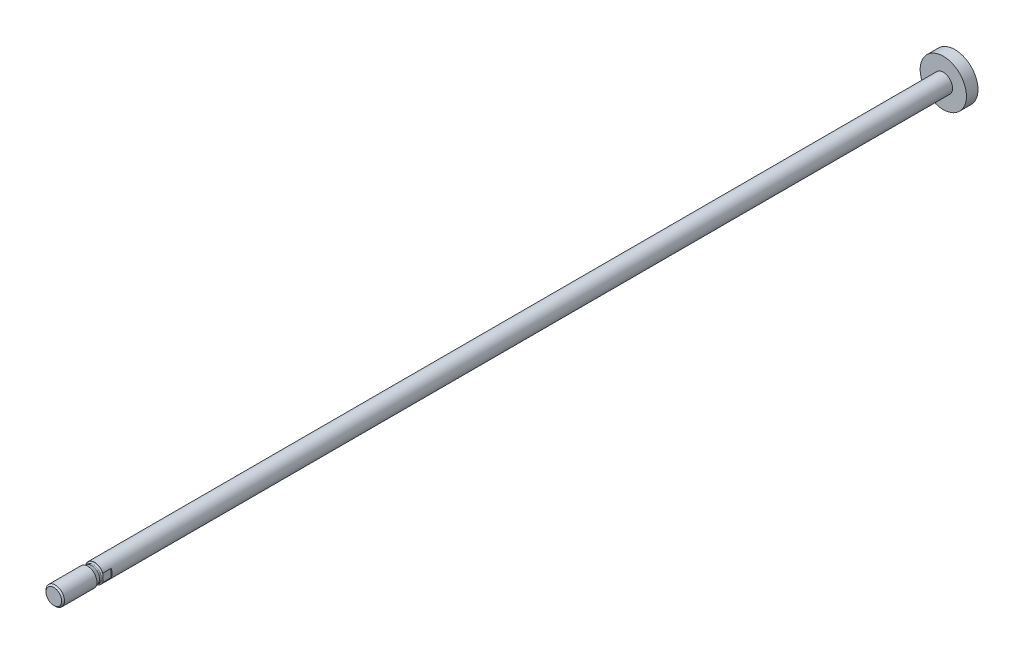
ISO-10303-21;
HEADER;
FILE_DESCRIPTION(('STEP AP214'),'2;1');
FILE_NAME('part.step','',(''),(''),'','','');
FILE_SCHEMA(('AUTOMOTIVE_DESIGN { 1 0 10303 214 1 1 1 1 }'));
ENDSEC;
DATA;
#1=APPLICATION_CONTEXT('core data for automotive mechanical design processes');
#2=APPLICATION_PROTOCOL_DEFINITION('international standard','automotive_design',2000,#1);
#3=PRODUCT_CONTEXT('',#1,'mechanical');
#4=PRODUCT('Part','Part','',(#3));
#5=PRODUCT_RELATED_PRODUCT_CATEGORY('part','',(#4));
#6=PRODUCT_DEFINITION_FORMATION('','',#4);
#7=PRODUCT_DEFINITION_CONTEXT('part definition',#1,'design');
#8=PRODUCT_DEFINITION('design','',#6,#7);
#9=PRODUCT_DEFINITION_SHAPE('','',#8);
#10=(LENGTH_UNIT() NAMED_UNIT(*) SI_UNIT(.MILLI.,.METRE.));
#11=(NAMED_UNIT(*) PLANE_ANGLE_UNIT() SI_UNIT($,.RADIAN.));
#12=(NAMED_UNIT(*) SI_UNIT($,.STERADIAN.) SOLID_ANGLE_UNIT());
#13=UNCERTAINTY_MEASURE_WITH_UNIT(LENGTH_MEASURE(1.E-05),#10,'distance_accuracy_value','');
#14=(GEOMETRIC_REPRESENTATION_CONTEXT(3) GLOBAL_UNCERTAINTY_ASSIGNED_CONTEXT((#13)) GLOBAL_UNIT_ASSIGNED_CONTEXT((#10,
#11,#12)) REPRESENTATION_CONTEXT('',''));
#15=CARTESIAN_POINT('',(0.,0.,0.));
#16=DIRECTION('',(0.,0.,1.));
#17=DIRECTION('',(1.,0.,0.));
#18=AXIS2_PLACEMENT_3D('',#15,#16,#17);
#19=CARTESIAN_POINT('',(0.,0.,28.));
#20=DIRECTION('',(0.,0.,-1.));
#21=DIRECTION('',(-1.,0.,0.));
#22=AXIS2_PLACEMENT_3D('',#19,#20,#21);
#23=PLANE('',#22);
#24=CARTESIAN_POINT('',(0.,0.,28.00000000002));
#25=DIRECTION('',(0.,0.,-1.));
#26=DIRECTION('',(-1.,0.,0.));
#27=AXIS2_PLACEMENT_3D('',#24,#25,#26);
#28=CIRCLE('',#27,4.23299999994242);
#29=CARTESIAN_POINT('',(-4.23299999994242,0.,28.00000000002));
#30=VERTEX_POINT('',#29);
#31=EDGE_CURVE('E19',#30,#30,#28,.T.);
#32=ORIENTED_EDGE('',*,*,#31,.F.);
#33=EDGE_LOOP('',(#32));
#34=FACE_BOUND('',#33,.T.);
#35=ADVANCED_FACE('F16',(#34),#23,.F.);
#36=CARTESIAN_POINT('',(0.,0.,27.2330000000807));
#37=DIRECTION('',(0.,0.,-1.));
#38=DIRECTION('',(-1.,0.,0.));
#39=AXIS2_PLACEMENT_3D('',#36,#37,#38);
#40=CONICAL_SURFACE('',#39,4.99999999988177,0.785398163397448);
#41=ORIENTED_EDGE('',*,*,#31,.T.);
#42=EDGE_LOOP('',(#41));
#43=FACE_BOUND('',#42,.T.);
#44=CARTESIAN_POINT('',(0.,0.,27.233));
#45=DIRECTION('',(0.,0.,1.));
#46=DIRECTION('',(1.,0.,0.));
#47=AXIS2_PLACEMENT_3D('',#44,#45,#46);
#48=CIRCLE('',#47,5.);
#49=CARTESIAN_POINT('',(5.,0.,27.233));
#50=VERTEX_POINT('',#49);
#51=EDGE_CURVE('E253',#50,#50,#48,.F.);
#52=ORIENTED_EDGE('',*,*,#51,.F.);
#53=EDGE_LOOP('',(#52));
#54=FACE_BOUND('',#53,.T.);
#55=ADVANCED_FACE('F240',(#43,#54),#40,.T.);
#56=CARTESIAN_POINT('',(0.,0.,5.));
#57=DIRECTION('',(0.,0.,1.));
#58=DIRECTION('',(1.,0.,0.));
#59=AXIS2_PLACEMENT_3D('',#56,#57,#58);
#60=CYLINDRICAL_SURFACE('',#59,5.);
#61=ORIENTED_EDGE('',*,*,#51,.T.);
#62=EDGE_LOOP('',(#61));
#63=FACE_BOUND('',#62,.T.);
#64=CARTESIAN_POINT('',(0.,0.,9.69798193557381));
#65=DIRECTION('',(0.,0.,1.));
#66=DIRECTION('',(1.,0.,0.));
#67=AXIS2_PLACEMENT_3D('',#64,#65,#66);
#68=CIRCLE('',#67,4.99999999999545);
#69=CARTESIAN_POINT('',(4.99999999999545,0.,9.69798193557381));
#70=VERTEX_POINT('',#69);
#71=EDGE_CURVE('E254',#70,#70,#68,.F.);
#72=ORIENTED_EDGE('',*,*,#71,.F.);
#73=EDGE_LOOP('',(#72));
#74=FACE_BOUND('',#73,.T.);
#75=ADVANCED_FACE('F237',(#63,#74),#60,.T.);
#76=CARTESIAN_POINT('',(0.,0.,9.69798193557381));
#77=DIRECTION('',(0.,0.,1.));
#78=DIRECTION('',(1.,0.,0.));
#79=AXIS2_PLACEMENT_3D('',#76,#77,#78);
#80=CONICAL_SURFACE('',#79,4.99999999999545,0.349065850396762);
#81=ORIENTED_EDGE('',*,*,#71,.T.);
#82=EDGE_LOOP('',(#81));
#83=FACE_BOUND('',#82,.T.);
#84=CARTESIAN_POINT('',(0.,0.,7.59941589757032));
#85=DIRECTION('',(0.,0.,-1.));
#86=DIRECTION('',(-1.,0.,0.));
#87=AXIS2_PLACEMENT_3D('',#84,#85,#86);
#88=CIRCLE('',#87,4.23618442752846);
#89=CARTESIAN_POINT('',(-4.23618442752846,0.,7.59941589757032));
#90=VERTEX_POINT('',#89);
#91=EDGE_CURVE('E220',#90,#90,#88,.F.);
#92=ORIENTED_EDGE('',*,*,#91,.T.);
#93=EDGE_LOOP('',(#92));
#94=FACE_BOUND('',#93,.T.);
#95=ADVANCED_FACE('F232',(#83,#94),#80,.T.);
#96=CARTESIAN_POINT('',(0.,0.,7.39420381157492));
#97=DIRECTION('',(0.,0.,-1.));
#98=DIRECTION('',(-1.,0.,0.));
#99=AXIS2_PLACEMENT_3D('',#96,#97,#98);
#100=TOROIDAL_SURFACE('',#99,4.8,0.599999999999999);
#101=ORIENTED_EDGE('',*,*,#91,.F.);
#102=EDGE_LOOP('',(#101));
#103=FACE_BOUND('',#102,.T.);
#104=CARTESIAN_POINT('',(0.,0.,7.39420381157492));
#105=DIRECTION('',(0.,0.,1.));
#106=DIRECTION('',(1.,0.,0.));
#107=AXIS2_PLACEMENT_3D('',#104,#105,#106);
#108=CIRCLE('',#107,4.2);
#109=CARTESIAN_POINT('',(4.2,0.,7.39420381157492));
#110=VERTEX_POINT('',#109);
#111=EDGE_CURVE('E211',#110,#110,#108,.F.);
#112=ORIENTED_EDGE('',*,*,#111,.F.);
#113=EDGE_LOOP('',(#112));
#114=FACE_BOUND('',#113,.T.);
#115=ADVANCED_FACE('F227',(#103,#114),#100,.F.);
#116=CARTESIAN_POINT('',(0.,12.5,-458.85));
#117=DIRECTION('',(0.,0.,1.));
#118=DIRECTION('',(1.,0.,0.));
#119=AXIS2_PLACEMENT_3D('',#116,#117,#118);
#120=PLANE('',#119);
#121=CARTESIAN_POINT('',(0.,0.,-458.85));
#122=DIRECTION('',(0.,0.,1.));
#123=DIRECTION('',(1.,0.,0.));
#124=AXIS2_PLACEMENT_3D('',#121,#122,#123);
#125=CIRCLE('',#124,12.5);
#126=CARTESIAN_POINT('',(12.5,0.,-458.85));
#127=VERTEX_POINT('',#126);
#128=EDGE_CURVE('E219',#127,#127,#125,.T.);
#129=ORIENTED_EDGE('',*,*,#128,.F.);
#130=EDGE_LOOP('',(#129));
#131=FACE_BOUND('',#130,.T.);
#132=ADVANCED_FACE('F231',(#131),#120,.F.);
#133=CARTESIAN_POINT('',(0.,0.,5.));
#134=DIRECTION('',(0.,0.,1.));
#135=DIRECTION('',(1.,0.,0.));
#136=AXIS2_PLACEMENT_3D('',#133,#134,#135);
#137=CYLINDRICAL_SURFACE('',#136,4.2);
#138=ORIENTED_EDGE('',*,*,#111,.T.);
#139=EDGE_LOOP('',(#138));
#140=FACE_BOUND('',#139,.T.);
#141=CARTESIAN_POINT('',(0.,0.,6.6));
#142=DIRECTION('',(0.,0.,-1.));
#143=DIRECTION('',(-1.,0.,0.));
#144=AXIS2_PLACEMENT_3D('',#141,#142,#143);
#145=CIRCLE('',#144,4.2);
#146=CARTESIAN_POINT('',(-4.2,0.,6.6));
#147=VERTEX_POINT('',#146);
#148=EDGE_CURVE('E275',#147,#147,#145,.F.);
#149=ORIENTED_EDGE('',*,*,#148,.T.);
#150=EDGE_LOOP('',(#149));
#151=FACE_BOUND('',#150,.T.);
#152=ADVANCED_FACE('F270',(#140,#151),#137,.T.);
#153=CARTESIAN_POINT('',(0.,0.,-458.85));
#154=DIRECTION('',(0.,0.,1.));
#155=DIRECTION('',(1.,0.,0.));
#156=AXIS2_PLACEMENT_3D('',#153,#154,#155);
#157=CYLINDRICAL_SURFACE('',#156,12.5);
#158=CARTESIAN_POINT('',(0.,0.,-452.6));
#159=DIRECTION('',(0.,0.,1.));
#160=DIRECTION('',(1.,0.,0.));
#161=AXIS2_PLACEMENT_3D('',#158,#159,#160);
#162=CIRCLE('',#161,12.5);
#163=CARTESIAN_POINT('',(12.5,0.,-452.6));
#164=VERTEX_POINT('',#163);
#165=EDGE_CURVE('E203',#164,#164,#162,.F.);
#166=ORIENTED_EDGE('',*,*,#165,.T.);
#167=EDGE_LOOP('',(#166));
#168=FACE_BOUND('',#167,.T.);
#169=ORIENTED_EDGE('',*,*,#128,.T.);
#170=EDGE_LOOP('',(#169));
#171=FACE_BOUND('',#170,.T.);
#172=ADVANCED_FACE('F173',(#168,#171),#157,.T.);
#173=CARTESIAN_POINT('',(0.,0.,6.6));
#174=DIRECTION('',(0.,0.,-1.));
#175=DIRECTION('',(-1.,0.,0.));
#176=AXIS2_PLACEMENT_3D('',#173,#174,#175);
#177=TOROIDAL_SURFACE('',#176,4.8,0.599999999999998);
#178=ORIENTED_EDGE('',*,*,#148,.F.);
#179=EDGE_LOOP('',(#178));
#180=FACE_BOUND('',#179,.T.);
#181=CARTESIAN_POINT('',(-4.5,-1.670329308849,6.));
#182=CARTESIAN_POINT('',(-4.5,-1.6369330513631,6.00000117040223));
#183=CARTESIAN_POINT('',(-4.5,-1.60353870008505,6.00033761281317));
#184=CARTESIAN_POINT('',(-4.5,-1.53678402517574,6.00158286188886));
#185=CARTESIAN_POINT('',(-4.5,-1.50342369418502,6.00249126346591));
#186=CARTESIAN_POINT('',(-4.5,-1.43672915385537,6.00478221519337));
#187=CARTESIAN_POINT('',(-4.5,-1.403394939861,6.00616463519658));
#188=CARTESIAN_POINT('',(-4.5,-1.33675010316127,6.0093127773252));
#189=CARTESIAN_POINT('',(-4.5,-1.30343947758629,6.0110784396036));
#190=CARTESIAN_POINT('',(-4.5,-1.23682740984282,6.01490639659544));
#191=CARTESIAN_POINT('',(-4.5,-1.20352597189788,6.01696876357747));
#192=CARTESIAN_POINT('',(-4.5,-1.13692453490198,6.02130706454382));
#193=CARTESIAN_POINT('',(-4.5,-1.10362454110037,6.02358307854023));
#194=CARTESIAN_POINT('',(-4.5,-0.970055500660211,6.03297450091988));
#195=CARTESIAN_POINT('',(-4.5,-0.869824880093467,6.04061462109113));
#196=CARTESIAN_POINT('',(-4.5,-0.669294095444825,6.05497755898394));
#197=CARTESIAN_POINT('',(-4.5,-0.568993932116027,6.06170038648787));
#198=CARTESIAN_POINT('',(-4.5,-0.368332410875038,6.07244573968657));
#199=CARTESIAN_POINT('',(-4.5,-0.26797120652601,6.076470876583));
#200=CARTESIAN_POINT('',(-4.5,-0.0672525736976672,6.08072036023677));
#201=CARTESIAN_POINT('',(-4.5,0.0331047738284561,6.08094818941855));
#202=CARTESIAN_POINT('',(-4.5,0.233769564385185,6.07754740137777));
#203=CARTESIAN_POINT('',(-4.5,0.334076991677368,6.07391793974281));
#204=CARTESIAN_POINT('',(-4.5,0.534637397699597,6.06379928349027));
#205=CARTESIAN_POINT('',(-4.5,0.634890214053077,6.05730714852695));
#206=CARTESIAN_POINT('',(-4.5,0.835373518086889,6.04317942656312));
#207=CARTESIAN_POINT('',(-4.5,0.935603947060965,6.03554308551951));
#208=CARTESIAN_POINT('',(-4.5,1.13611388640718,6.02119700715942));
#209=CARTESIAN_POINT('',(-4.5,1.23639337665127,6.01448702408238));
#210=CARTESIAN_POINT('',(-4.5,1.39231556393481,6.00654495544654));
#211=CARTESIAN_POINT('',(-4.5,1.44789697514886,6.00420470218304));
#212=CARTESIAN_POINT('',(-4.5,1.55909116687587,6.00093588356944));
#213=CARTESIAN_POINT('',(-4.5,1.61470394147135,6.00000710765029));
#214=CARTESIAN_POINT('',(-4.5,1.67032930884898,6.));
#215=B_SPLINE_CURVE_WITH_KNOTS('',3,(#181,#182,#183,#184,#185,#186,#187,#188,#189,#190,#191,
#192,#193,#194,#195,#196,#197,#198,#199,#200,#201,#202,#203,#204,#205,#206,#207,#208,#209,#210,
#211,#212,#213,#214),.UNSPECIFIED.,.F.,.F.,(4,2,2,2,2,2,2,2,2,2,2,2,2,2,2,2,4),(0.,
0.100184360814044,0.200297846163573,0.300383866187946,0.400454268039522,0.500549085512339,
0.600681539794873,0.902246113316891,1.20380747058151,1.50507651146084,1.80606925014599,
2.10712789373254,2.4084964874746,2.71006456677907,3.01155248641771,3.17842827063363,
3.34527915730057),.UNSPECIFIED.);
#216=CARTESIAN_POINT('',(-4.5,-1.670329308849,6.));
#217=VERTEX_POINT('',#216);
#218=CARTESIAN_POINT('',(-4.5,1.67032930884898,5.99999999999986));
#219=VERTEX_POINT('',#218);
#220=EDGE_CURVE('E99',#217,#219,#215,.T.);
#221=ORIENTED_EDGE('',*,*,#220,.F.);
#222=CARTESIAN_POINT('',(0.,0.,6.));
#223=DIRECTION('',(0.,0.,1.));
#224=DIRECTION('',(-0.9375,-0.347985272676876,0.));
#225=AXIS2_PLACEMENT_3D('',#222,#223,#224);
#226=CIRCLE('',#225,4.79999999999999);
#227=CARTESIAN_POINT('',(4.5,-1.67032930884898,5.99999999999993));
#228=VERTEX_POINT('',#227);
#229=EDGE_CURVE('E143',#217,#228,#226,.T.);
#230=ORIENTED_EDGE('',*,*,#229,.T.);
#231=CARTESIAN_POINT('',(4.5,1.670329308849,6.));
#232=CARTESIAN_POINT('',(4.5,1.6369330513631,6.00000117040223));
#233=CARTESIAN_POINT('',(4.5,1.60353870008505,6.00033761281317));
#234=CARTESIAN_POINT('',(4.5,1.53678402517574,6.00158286188886));
#235=CARTESIAN_POINT('',(4.5,1.50342369418502,6.00249126346591));
#236=CARTESIAN_POINT('',(4.5,1.43672915385538,6.00478221519337));
#237=CARTESIAN_POINT('',(4.5,1.403394939861,6.00616463519658));
#238=CARTESIAN_POINT('',(4.5,1.33675010316128,6.0093127773252));
#239=CARTESIAN_POINT('',(4.5,1.30343947758629,6.0110784396036));
#240=CARTESIAN_POINT('',(4.5,1.23682740984282,6.01490639659544));
#241=CARTESIAN_POINT('',(4.5,1.20352597189788,6.01696876357747));
#242=CARTESIAN_POINT('',(4.5,1.13692453490198,6.02130706454382));
#243=CARTESIAN_POINT('',(4.5,1.10362454110037,6.02358307854023));
#244=CARTESIAN_POINT('',(4.5,0.970055500660213,6.03297450091988));
#245=CARTESIAN_POINT('',(4.5,0.869824880093468,6.04061462109113));
#246=CARTESIAN_POINT('',(4.5,0.669294095444826,6.05497755898394));
#247=CARTESIAN_POINT('',(4.5,0.568993932116028,6.06170038648787));
#248=CARTESIAN_POINT('',(4.5,0.368332410875039,6.07244573968657));
#249=CARTESIAN_POINT('',(4.5,0.267971206526011,6.076470876583));
#250=CARTESIAN_POINT('',(4.5,0.0672525736976679,6.08072036023677));
#251=CARTESIAN_POINT('',(4.5,-0.0331047738284553,6.08094818941855));
#252=CARTESIAN_POINT('',(4.5,-0.233769564385184,6.07754740137777));
#253=CARTESIAN_POINT('',(4.5,-0.334076991677367,6.07391793974281));
#254=CARTESIAN_POINT('',(4.5,-0.534637397699596,6.06379928349027));
#255=CARTESIAN_POINT('',(4.5,-0.634890214053076,6.05730714852695));
#256=CARTESIAN_POINT('',(4.5,-0.835373518086889,6.04317942656312));
#257=CARTESIAN_POINT('',(4.5,-0.935603947060965,6.03554308551951));
#258=CARTESIAN_POINT('',(4.5,-1.13611388640718,6.02119700715942));
#259=CARTESIAN_POINT('',(4.5,-1.23639337665127,6.01448702408238));
#260=CARTESIAN_POINT('',(4.5,-1.39231556393481,6.00654495544654));
#261=CARTESIAN_POINT('',(4.5,-1.44789697514886,6.00420470218304));
#262=CARTESIAN_POINT('',(4.5,-1.55909116687587,6.00093588356944));
#263=CARTESIAN_POINT('',(4.5,-1.61470394147135,6.00000710765029));
#264=CARTESIAN_POINT('',(4.5,-1.67032930884898,6.));
#265=B_SPLINE_CURVE_WITH_KNOTS('',3,(#231,#232,#233,#234,#235,#236,#237,#238,#239,#240,#241,
#242,#243,#244,#245,#246,#247,#248,#249,#250,#251,#252,#253,#254,#255,#256,#257,#258,#259,#260,
#261,#262,#263,#264),.UNSPECIFIED.,.F.,.F.,(4,2,2,2,2,2,2,2,2,2,2,2,2,2,2,2,4),(0.,
0.100184360814044,0.200297846163573,0.300383866187946,0.400454268039522,0.500549085512339,
0.600681539794873,0.902246113316891,1.20380747058151,1.50507651146084,1.80606925014599,
2.10712789373254,2.4084964874746,2.71006456677907,3.01155248641771,3.17842827063363,
3.34527915730057),.UNSPECIFIED.);
#266=CARTESIAN_POINT('',(4.5,1.670329308849,6.));
#267=VERTEX_POINT('',#266);
#268=EDGE_CURVE('E75',#267,#228,#265,.T.);
#269=ORIENTED_EDGE('',*,*,#268,.F.);
#270=CARTESIAN_POINT('',(0.,0.,6.));
#271=DIRECTION('',(0.,0.,1.));
#272=DIRECTION('',(0.9375,0.347985272676875,0.));
#273=AXIS2_PLACEMENT_3D('',#270,#271,#272);
#274=CIRCLE('',#273,4.79999999999999);
#275=EDGE_CURVE('E70',#267,#219,#274,.T.);
#276=ORIENTED_EDGE('',*,*,#275,.T.);
#277=EDGE_LOOP('',(#221,#230,#269,#276));
#278=FACE_BOUND('',#277,.T.);
#279=ADVANCED_FACE('F110',(#180,#278),#177,.F.);
#280=CARTESIAN_POINT('',(0.,5.,-452.6));
#281=DIRECTION('',(0.,0.,-1.));
#282=DIRECTION('',(-1.,0.,0.));
#283=AXIS2_PLACEMENT_3D('',#280,#281,#282);
#284=PLANE('',#283);
#285=CARTESIAN_POINT('',(0.,0.,-452.6));
#286=DIRECTION('',(0.,0.,1.));
#287=DIRECTION('',(1.,0.,0.));
#288=AXIS2_PLACEMENT_3D('',#285,#286,#287);
#289=CIRCLE('',#288,5.);
#290=CARTESIAN_POINT('',(5.,0.,-452.6));
#291=VERTEX_POINT('',#290);
#292=EDGE_CURVE('E92',#291,#291,#289,.T.);
#293=ORIENTED_EDGE('',*,*,#292,.F.);
#294=EDGE_LOOP('',(#293));
#295=FACE_BOUND('',#294,.T.);
#296=ORIENTED_EDGE('',*,*,#165,.F.);
#297=EDGE_LOOP('',(#296));
#298=FACE_BOUND('',#297,.T.);
#299=ADVANCED_FACE('F166',(#295,#298),#284,.F.);
#300=CARTESIAN_POINT('',(0.,0.,6.));
#301=DIRECTION('',(0.,0.,-1.));
#302=DIRECTION('',(-1.,0.,0.));
#303=AXIS2_PLACEMENT_3D('',#300,#301,#302);
#304=PLANE('',#303);
#305=CARTESIAN_POINT('',(0.,0.,6.00000000000001));
#306=DIRECTION('',(0.,0.,1.));
#307=DIRECTION('',(1.,0.,0.));
#308=AXIS2_PLACEMENT_3D('',#305,#306,#307);
#309=CIRCLE('',#308,5.);
#310=CARTESIAN_POINT('',(-4.5,2.17944947177034,5.99999999999982));
#311=VERTEX_POINT('',#310);
#312=CARTESIAN_POINT('',(4.5,2.17944947177034,6.00000000000001));
#313=VERTEX_POINT('',#312);
#314=EDGE_CURVE('E67',#311,#313,#309,.F.);
#315=ORIENTED_EDGE('',*,*,#314,.F.);
#316=DIRECTION('',(0.,1.,0.));
#317=VECTOR('',#316,1.);
#318=CARTESIAN_POINT('',(-4.5,-9.,5.99999999999964));
#319=LINE('',#318,#317);
#320=EDGE_CURVE('E57',#219,#311,#319,.T.);
#321=ORIENTED_EDGE('',*,*,#320,.F.);
#322=ORIENTED_EDGE('',*,*,#275,.F.);
#323=DIRECTION('',(0.,1.,0.));
#324=VECTOR('',#323,1.);
#325=CARTESIAN_POINT('',(4.5,9.,6.00000000000001));
#326=LINE('',#325,#324);
#327=EDGE_CURVE('E63',#313,#267,#326,.F.);
#328=ORIENTED_EDGE('',*,*,#327,.F.);
#329=EDGE_LOOP('',(#315,#321,#322,#328));
#330=FACE_BOUND('',#329,.T.);
#331=ADVANCED_FACE('F65',(#330),#304,.F.);
#332=CARTESIAN_POINT('',(0.,0.,1.5));
#333=DIRECTION('',(0.,0.,1.));
#334=DIRECTION('',(1.,0.,0.));
#335=AXIS2_PLACEMENT_3D('',#332,#333,#334);
#336=PLANE('',#335);
#337=CARTESIAN_POINT('',(0.,0.,1.5));
#338=DIRECTION('',(0.,0.,1.));
#339=DIRECTION('',(1.,0.,0.));
#340=AXIS2_PLACEMENT_3D('',#337,#338,#339);
#341=CIRCLE('',#340,5.);
#342=CARTESIAN_POINT('',(4.5,2.17944947177034,1.5));
#343=VERTEX_POINT('',#342);
#344=CARTESIAN_POINT('',(4.5,-2.17944947177034,1.5));
#345=VERTEX_POINT('',#344);
#346=EDGE_CURVE('E85',#343,#345,#341,.F.);
#347=ORIENTED_EDGE('',*,*,#346,.F.);
#348=DIRECTION('',(0.,1.,0.));
#349=VECTOR('',#348,1.);
#350=CARTESIAN_POINT('',(4.5,9.,1.5));
#351=LINE('',#350,#349);
#352=EDGE_CURVE('E76',#345,#343,#351,.T.);
#353=ORIENTED_EDGE('',*,*,#352,.F.);
#354=EDGE_LOOP('',(#347,#353));
#355=FACE_BOUND('',#354,.T.);
#356=ADVANCED_FACE('F165',(#355),#336,.T.);
#357=CARTESIAN_POINT('',(4.5,9.,7.));
#358=DIRECTION('',(1.,0.,0.));
#359=DIRECTION('',(0.,0.,-1.));
#360=AXIS2_PLACEMENT_3D('',#357,#358,#359);
#361=PLANE('',#360);
#362=ORIENTED_EDGE('',*,*,#268,.T.);
#363=DIRECTION('',(0.,1.,0.));
#364=VECTOR('',#363,1.);
#365=CARTESIAN_POINT('',(4.5,0.,6.));
#366=LINE('',#365,#364);
#367=CARTESIAN_POINT('',(4.5,-2.17944947177034,6.));
#368=VERTEX_POINT('',#367);
#369=EDGE_CURVE('E136',#228,#368,#366,.F.);
#370=ORIENTED_EDGE('',*,*,#369,.T.);
#371=DIRECTION('',(0.,0.,1.));
#372=VECTOR('',#371,1.);
#373=CARTESIAN_POINT('',(4.5,-2.17944947177034,-458.85));
#374=LINE('',#373,#372);
#375=EDGE_CURVE('E146',#345,#368,#374,.T.);
#376=ORIENTED_EDGE('',*,*,#375,.F.);
#377=ORIENTED_EDGE('',*,*,#352,.T.);
#378=DIRECTION('',(0.,0.,1.));
#379=VECTOR('',#378,1.);
#380=CARTESIAN_POINT('',(4.5,2.17944947177034,-458.85));
#381=LINE('',#380,#379);
#382=EDGE_CURVE('E79',#313,#343,#381,.F.);
#383=ORIENTED_EDGE('',*,*,#382,.F.);
#384=ORIENTED_EDGE('',*,*,#327,.T.);
#385=EDGE_LOOP('',(#362,#370,#376,#377,#383,#384));
#386=FACE_BOUND('',#385,.T.);
#387=ADVANCED_FACE('F80',(#386),#361,.T.);
#388=CARTESIAN_POINT('',(0.,0.,6.));
#389=DIRECTION('',(0.,0.,-1.));
#390=DIRECTION('',(-1.,0.,0.));
#391=AXIS2_PLACEMENT_3D('',#388,#389,#390);
#392=PLANE('',#391);
#393=CARTESIAN_POINT('',(0.,0.,6.00000000000001));
#394=DIRECTION('',(0.,0.,1.));
#395=DIRECTION('',(1.,0.,0.));
#396=AXIS2_PLACEMENT_3D('',#393,#394,#395);
#397=CIRCLE('',#396,5.);
#398=CARTESIAN_POINT('',(-4.5,-2.17944947177034,6.00000000000001));
#399=VERTEX_POINT('',#398);
#400=EDGE_CURVE('E148',#368,#399,#397,.F.);
#401=ORIENTED_EDGE('',*,*,#400,.F.);
#402=ORIENTED_EDGE('',*,*,#369,.F.);
#403=ORIENTED_EDGE('',*,*,#229,.F.);
#404=DIRECTION('',(0.,1.,0.));
#405=VECTOR('',#404,1.);
#406=CARTESIAN_POINT('',(-4.5,-9.,6.00000000000001));
#407=LINE('',#406,#405);
#408=EDGE_CURVE('E101',#399,#217,#407,.T.);
#409=ORIENTED_EDGE('',*,*,#408,.F.);
#410=EDGE_LOOP('',(#401,#402,#403,#409));
#411=FACE_BOUND('',#410,.T.);
#412=ADVANCED_FACE('F121',(#411),#392,.F.);
#413=CARTESIAN_POINT('',(-4.5,-9.,7.));
#414=DIRECTION('',(-1.,0.,0.));
#415=DIRECTION('',(0.,0.,1.));
#416=AXIS2_PLACEMENT_3D('',#413,#414,#415);
#417=PLANE('',#416);
#418=ORIENTED_EDGE('',*,*,#220,.T.);
#419=ORIENTED_EDGE('',*,*,#320,.T.);
#420=DIRECTION('',(0.,0.,1.));
#421=VECTOR('',#420,1.);
#422=CARTESIAN_POINT('',(-4.5,2.17944947177034,-458.85));
#423=LINE('',#422,#421);
#424=CARTESIAN_POINT('',(-4.5,2.17944947177034,1.5));
#425=VERTEX_POINT('',#424);
#426=EDGE_CURVE('E90',#425,#311,#423,.T.);
#427=ORIENTED_EDGE('',*,*,#426,.F.);
#428=DIRECTION('',(0.,1.,0.));
#429=VECTOR('',#428,1.);
#430=CARTESIAN_POINT('',(-4.5,0.,1.5));
#431=LINE('',#430,#429);
#432=CARTESIAN_POINT('',(-4.5,-2.17944947177034,1.5));
#433=VERTEX_POINT('',#432);
#434=EDGE_CURVE('E34',#433,#425,#431,.T.);
#435=ORIENTED_EDGE('',*,*,#434,.F.);
#436=DIRECTION('',(0.,0.,1.));
#437=VECTOR('',#436,1.);
#438=CARTESIAN_POINT('',(-4.5,-2.17944947177034,-458.85));
#439=LINE('',#438,#437);
#440=EDGE_CURVE('E25',#399,#433,#439,.F.);
#441=ORIENTED_EDGE('',*,*,#440,.F.);
#442=ORIENTED_EDGE('',*,*,#408,.T.);
#443=EDGE_LOOP('',(#418,#419,#427,#435,#441,#442));
#444=FACE_BOUND('',#443,.T.);
#445=ADVANCED_FACE('F115',(#444),#417,.T.);
#446=CARTESIAN_POINT('',(0.,0.,1.5));
#447=DIRECTION('',(0.,0.,1.));
#448=DIRECTION('',(1.,0.,0.));
#449=AXIS2_PLACEMENT_3D('',#446,#447,#448);
#450=PLANE('',#449);
#451=CARTESIAN_POINT('',(0.,0.,1.5));
#452=DIRECTION('',(0.,0.,1.));
#453=DIRECTION('',(1.,0.,0.));
#454=AXIS2_PLACEMENT_3D('',#451,#452,#453);
#455=CIRCLE('',#454,5.);
#456=EDGE_CURVE('E11',#433,#425,#455,.F.);
#457=ORIENTED_EDGE('',*,*,#456,.F.);
#458=ORIENTED_EDGE('',*,*,#434,.T.);
#459=EDGE_LOOP('',(#457,#458));
#460=FACE_BOUND('',#459,.T.);
#461=ADVANCED_FACE('F120',(#460),#450,.T.);
#462=CARTESIAN_POINT('',(0.,0.,-458.85));
#463=DIRECTION('',(0.,0.,1.));
#464=DIRECTION('',(1.,0.,0.));
#465=AXIS2_PLACEMENT_3D('',#462,#463,#464);
#466=CYLINDRICAL_SURFACE('',#465,5.);
#467=ORIENTED_EDGE('',*,*,#440,.T.);
#468=ORIENTED_EDGE('',*,*,#456,.T.);
#469=ORIENTED_EDGE('',*,*,#426,.T.);
#470=ORIENTED_EDGE('',*,*,#314,.T.);
#471=ORIENTED_EDGE('',*,*,#382,.T.);
#472=ORIENTED_EDGE('',*,*,#346,.T.);
#473=ORIENTED_EDGE('',*,*,#375,.T.);
#474=ORIENTED_EDGE('',*,*,#400,.T.);
#475=EDGE_LOOP('',(#467,#468,#469,#470,#471,#472,#473,#474));
#476=FACE_BOUND('',#475,.T.);
#477=ORIENTED_EDGE('',*,*,#292,.T.);
#478=EDGE_LOOP('',(#477));
#479=FACE_BOUND('',#478,.T.);
#480=ADVANCED_FACE('F88',(#476,#479),#466,.T.);
#481=CLOSED_SHELL('',(#35,#55,#75,#95,#115,#132,#152,#172,#279,#299,#331,#356,#387,#412,#445,
#461,#480));
#482=MANIFOLD_SOLID_BREP('B1',#481);
#483=ADVANCED_BREP_SHAPE_REPRESENTATION('',(#18,#482),#14);
#484=SHAPE_DEFINITION_REPRESENTATION(#9,#483);
ENDSEC;
END-ISO-10303-21;
